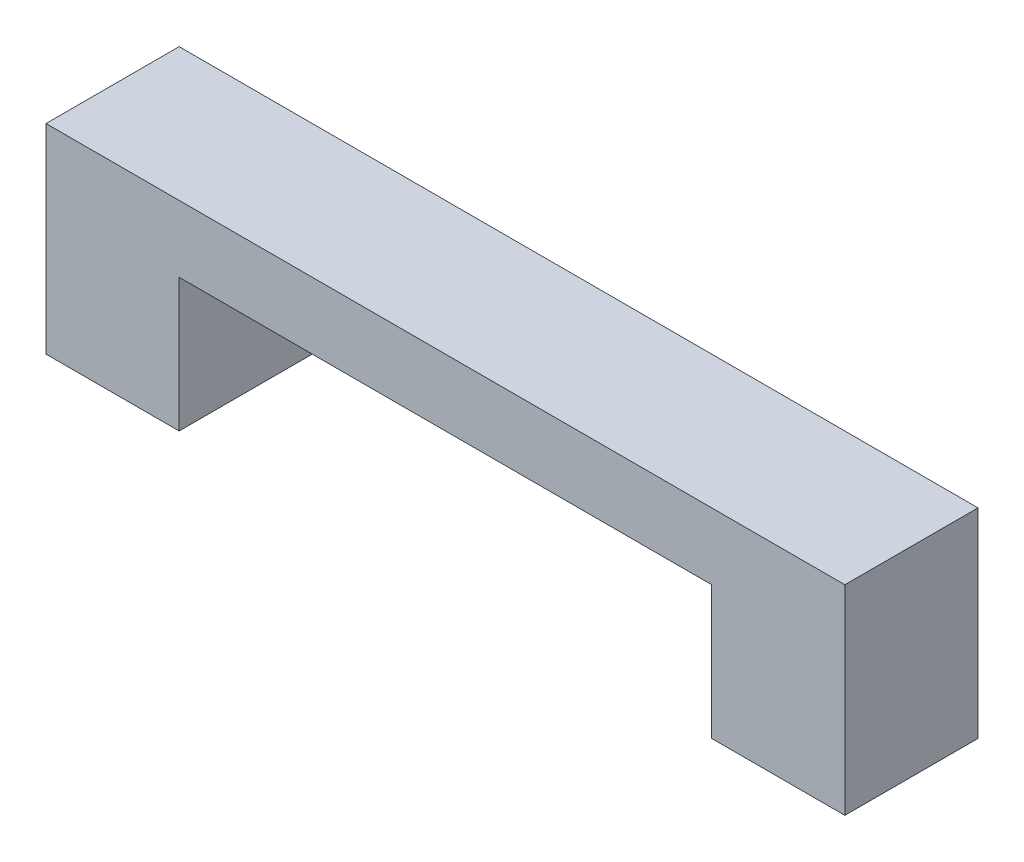
ISO-10303-21;
HEADER;
FILE_DESCRIPTION(('STEP AP214'),'2;1');
FILE_NAME('part.step','',(''),(''),'','','');
FILE_SCHEMA(('AUTOMOTIVE_DESIGN { 1 0 10303 214 1 1 1 1 }'));
ENDSEC;
DATA;
#1=APPLICATION_CONTEXT('core data for automotive mechanical design processes');
#2=APPLICATION_PROTOCOL_DEFINITION('international standard','automotive_design',2000,#1);
#3=PRODUCT_CONTEXT('',#1,'mechanical');
#4=PRODUCT('Part','Part','',(#3));
#5=PRODUCT_RELATED_PRODUCT_CATEGORY('part','',(#4));
#6=PRODUCT_DEFINITION_FORMATION('','',#4);
#7=PRODUCT_DEFINITION_CONTEXT('part definition',#1,'design');
#8=PRODUCT_DEFINITION('design','',#6,#7);
#9=PRODUCT_DEFINITION_SHAPE('','',#8);
#10=(LENGTH_UNIT() NAMED_UNIT(*) SI_UNIT(.MILLI.,.METRE.));
#11=(NAMED_UNIT(*) PLANE_ANGLE_UNIT() SI_UNIT($,.RADIAN.));
#12=(NAMED_UNIT(*) SI_UNIT($,.STERADIAN.) SOLID_ANGLE_UNIT());
#13=UNCERTAINTY_MEASURE_WITH_UNIT(LENGTH_MEASURE(1.E-05),#10,'distance_accuracy_value','');
#14=(GEOMETRIC_REPRESENTATION_CONTEXT(3) GLOBAL_UNCERTAINTY_ASSIGNED_CONTEXT((#13)) GLOBAL_UNIT_ASSIGNED_CONTEXT((#10,
#11,#12)) REPRESENTATION_CONTEXT('',''));
#15=CARTESIAN_POINT('',(0.,0.,0.));
#16=DIRECTION('',(0.,0.,1.));
#17=DIRECTION('',(1.,0.,0.));
#18=AXIS2_PLACEMENT_3D('',#15,#16,#17);
#19=CARTESIAN_POINT('',(0.,0.,2.));
#20=DIRECTION('',(-1.,0.,0.));
#21=DIRECTION('',(0.,0.,1.));
#22=AXIS2_PLACEMENT_3D('',#19,#20,#21);
#23=PLANE('',#22);
#24=DIRECTION('',(0.,1.,0.));
#25=VECTOR('',#24,1.);
#26=CARTESIAN_POINT('',(0.,0.,0.));
#27=LINE('',#26,#25);
#28=CARTESIAN_POINT('',(0.,0.,0.));
#29=VERTEX_POINT('',#28);
#30=CARTESIAN_POINT('',(0.,2.,0.));
#31=VERTEX_POINT('',#30);
#32=EDGE_CURVE('E145',#29,#31,#27,.T.);
#33=ORIENTED_EDGE('',*,*,#32,.T.);
#34=DIRECTION('',(0.,0.,-1.));
#35=VECTOR('',#34,1.);
#36=CARTESIAN_POINT('',(0.,2.,2.));
#37=LINE('',#36,#35);
#38=CARTESIAN_POINT('',(0.,2.,2.));
#39=VERTEX_POINT('',#38);
#40=EDGE_CURVE('E11',#39,#31,#37,.T.);
#41=ORIENTED_EDGE('',*,*,#40,.F.);
#42=DIRECTION('',(0.,1.,0.));
#43=VECTOR('',#42,1.);
#44=CARTESIAN_POINT('',(0.,0.,2.));
#45=LINE('',#44,#43);
#46=CARTESIAN_POINT('',(0.,0.,2.));
#47=VERTEX_POINT('',#46);
#48=EDGE_CURVE('E166',#47,#39,#45,.T.);
#49=ORIENTED_EDGE('',*,*,#48,.F.);
#50=DIRECTION('',(0.,0.,-1.));
#51=VECTOR('',#50,1.);
#52=CARTESIAN_POINT('',(0.,0.,2.));
#53=LINE('',#52,#51);
#54=EDGE_CURVE('E141',#47,#29,#53,.T.);
#55=ORIENTED_EDGE('',*,*,#54,.T.);
#56=EDGE_LOOP('',(#33,#41,#49,#55));
#57=FACE_BOUND('',#56,.T.);
#58=ADVANCED_FACE('F43',(#57),#23,.F.);
#59=CARTESIAN_POINT('',(0.,2.,2.));
#60=DIRECTION('',(0.,1.,0.));
#61=DIRECTION('',(0.,0.,1.));
#62=AXIS2_PLACEMENT_3D('',#59,#60,#61);
#63=PLANE('',#62);
#64=DIRECTION('',(1.,0.,0.));
#65=VECTOR('',#64,1.);
#66=CARTESIAN_POINT('',(0.,2.,0.));
#67=LINE('',#66,#65);
#68=CARTESIAN_POINT('',(8.,2.,0.));
#69=VERTEX_POINT('',#68);
#70=EDGE_CURVE('E149',#31,#69,#67,.T.);
#71=ORIENTED_EDGE('',*,*,#70,.T.);
#72=DIRECTION('',(0.,0.,-1.));
#73=VECTOR('',#72,1.);
#74=CARTESIAN_POINT('',(8.,2.,2.));
#75=LINE('',#74,#73);
#76=CARTESIAN_POINT('',(8.,2.,2.));
#77=VERTEX_POINT('',#76);
#78=EDGE_CURVE('E52',#77,#69,#75,.T.);
#79=ORIENTED_EDGE('',*,*,#78,.F.);
#80=DIRECTION('',(1.,0.,0.));
#81=VECTOR('',#80,1.);
#82=CARTESIAN_POINT('',(0.,2.,2.));
#83=LINE('',#82,#81);
#84=EDGE_CURVE('E103',#39,#77,#83,.T.);
#85=ORIENTED_EDGE('',*,*,#84,.F.);
#86=ORIENTED_EDGE('',*,*,#40,.T.);
#87=EDGE_LOOP('',(#71,#79,#85,#86));
#88=FACE_BOUND('',#87,.T.);
#89=ADVANCED_FACE('F212',(#88),#63,.F.);
#90=CARTESIAN_POINT('',(8.,0.,2.));
#91=DIRECTION('',(1.,0.,0.));
#92=DIRECTION('',(0.,1.,0.));
#93=AXIS2_PLACEMENT_3D('',#90,#91,#92);
#94=PLANE('',#93);
#95=DIRECTION('',(0.,-1.,0.));
#96=VECTOR('',#95,1.);
#97=CARTESIAN_POINT('',(8.,0.,0.));
#98=LINE('',#97,#96);
#99=CARTESIAN_POINT('',(8.,0.,0.));
#100=VERTEX_POINT('',#99);
#101=EDGE_CURVE('E151',#69,#100,#98,.T.);
#102=ORIENTED_EDGE('',*,*,#101,.T.);
#103=DIRECTION('',(0.,0.,-1.));
#104=VECTOR('',#103,1.);
#105=CARTESIAN_POINT('',(8.,0.,2.));
#106=LINE('',#105,#104);
#107=CARTESIAN_POINT('',(8.,0.,2.));
#108=VERTEX_POINT('',#107);
#109=EDGE_CURVE('E177',#108,#100,#106,.T.);
#110=ORIENTED_EDGE('',*,*,#109,.F.);
#111=DIRECTION('',(0.,-1.,0.));
#112=VECTOR('',#111,1.);
#113=CARTESIAN_POINT('',(8.,0.,2.));
#114=LINE('',#113,#112);
#115=EDGE_CURVE('E188',#77,#108,#114,.T.);
#116=ORIENTED_EDGE('',*,*,#115,.F.);
#117=ORIENTED_EDGE('',*,*,#78,.T.);
#118=EDGE_LOOP('',(#102,#110,#116,#117));
#119=FACE_BOUND('',#118,.T.);
#120=ADVANCED_FACE('F186',(#119),#94,.F.);
#121=CARTESIAN_POINT('',(10.,0.,2.));
#122=DIRECTION('',(0.,1.,0.));
#123=DIRECTION('',(0.,0.,1.));
#124=AXIS2_PLACEMENT_3D('',#121,#122,#123);
#125=PLANE('',#124);
#126=DIRECTION('',(1.,0.,0.));
#127=VECTOR('',#126,1.);
#128=CARTESIAN_POINT('',(10.,0.,0.));
#129=LINE('',#128,#127);
#130=CARTESIAN_POINT('',(10.,0.,0.));
#131=VERTEX_POINT('',#130);
#132=EDGE_CURVE('E154',#100,#131,#129,.T.);
#133=ORIENTED_EDGE('',*,*,#132,.T.);
#134=DIRECTION('',(0.,0.,-1.));
#135=VECTOR('',#134,1.);
#136=CARTESIAN_POINT('',(10.,0.,2.));
#137=LINE('',#136,#135);
#138=CARTESIAN_POINT('',(10.,0.,2.));
#139=VERTEX_POINT('',#138);
#140=EDGE_CURVE('E173',#139,#131,#137,.T.);
#141=ORIENTED_EDGE('',*,*,#140,.F.);
#142=DIRECTION('',(1.,0.,0.));
#143=VECTOR('',#142,1.);
#144=CARTESIAN_POINT('',(10.,0.,2.));
#145=LINE('',#144,#143);
#146=EDGE_CURVE('E200',#108,#139,#145,.T.);
#147=ORIENTED_EDGE('',*,*,#146,.F.);
#148=ORIENTED_EDGE('',*,*,#109,.T.);
#149=EDGE_LOOP('',(#133,#141,#147,#148));
#150=FACE_BOUND('',#149,.T.);
#151=ADVANCED_FACE('F196',(#150),#125,.F.);
#152=CARTESIAN_POINT('',(10.,3.,2.));
#153=DIRECTION('',(-1.,0.,0.));
#154=DIRECTION('',(0.,-1.,0.));
#155=AXIS2_PLACEMENT_3D('',#152,#153,#154);
#156=PLANE('',#155);
#157=DIRECTION('',(0.,1.,0.));
#158=VECTOR('',#157,1.);
#159=CARTESIAN_POINT('',(10.,3.,0.));
#160=LINE('',#159,#158);
#161=CARTESIAN_POINT('',(10.,3.,0.));
#162=VERTEX_POINT('',#161);
#163=EDGE_CURVE('E157',#131,#162,#160,.T.);
#164=ORIENTED_EDGE('',*,*,#163,.T.);
#165=DIRECTION('',(0.,0.,-1.));
#166=VECTOR('',#165,1.);
#167=CARTESIAN_POINT('',(10.,3.,2.));
#168=LINE('',#167,#166);
#169=CARTESIAN_POINT('',(10.,3.,2.));
#170=VERTEX_POINT('',#169);
#171=EDGE_CURVE('E133',#170,#162,#168,.T.);
#172=ORIENTED_EDGE('',*,*,#171,.F.);
#173=DIRECTION('',(0.,1.,0.));
#174=VECTOR('',#173,1.);
#175=CARTESIAN_POINT('',(10.,3.,2.));
#176=LINE('',#175,#174);
#177=EDGE_CURVE('E122',#139,#170,#176,.T.);
#178=ORIENTED_EDGE('',*,*,#177,.F.);
#179=ORIENTED_EDGE('',*,*,#140,.T.);
#180=EDGE_LOOP('',(#164,#172,#178,#179));
#181=FACE_BOUND('',#180,.T.);
#182=ADVANCED_FACE('F199',(#181),#156,.F.);
#183=CARTESIAN_POINT('',(-2.,3.,2.));
#184=DIRECTION('',(0.,-1.,0.));
#185=DIRECTION('',(0.,0.,-1.));
#186=AXIS2_PLACEMENT_3D('',#183,#184,#185);
#187=PLANE('',#186);
#188=DIRECTION('',(-1.,0.,0.));
#189=VECTOR('',#188,1.);
#190=CARTESIAN_POINT('',(-2.,3.,0.));
#191=LINE('',#190,#189);
#192=CARTESIAN_POINT('',(-2.,3.,0.));
#193=VERTEX_POINT('',#192);
#194=EDGE_CURVE('E131',#162,#193,#191,.T.);
#195=ORIENTED_EDGE('',*,*,#194,.T.);
#196=DIRECTION('',(0.,0.,-1.));
#197=VECTOR('',#196,1.);
#198=CARTESIAN_POINT('',(-2.,3.,2.));
#199=LINE('',#198,#197);
#200=CARTESIAN_POINT('',(-2.,3.,2.));
#201=VERTEX_POINT('',#200);
#202=EDGE_CURVE('E128',#201,#193,#199,.T.);
#203=ORIENTED_EDGE('',*,*,#202,.F.);
#204=DIRECTION('',(-1.,0.,0.));
#205=VECTOR('',#204,1.);
#206=CARTESIAN_POINT('',(-2.,3.,2.));
#207=LINE('',#206,#205);
#208=EDGE_CURVE('E116',#170,#201,#207,.T.);
#209=ORIENTED_EDGE('',*,*,#208,.F.);
#210=ORIENTED_EDGE('',*,*,#171,.T.);
#211=EDGE_LOOP('',(#195,#203,#209,#210));
#212=FACE_BOUND('',#211,.T.);
#213=ADVANCED_FACE('F129',(#212),#187,.F.);
#214=CARTESIAN_POINT('',(-2.,0.,2.));
#215=DIRECTION('',(1.,0.,0.));
#216=DIRECTION('',(0.,0.,-1.));
#217=AXIS2_PLACEMENT_3D('',#214,#215,#216);
#218=PLANE('',#217);
#219=DIRECTION('',(0.,-1.,0.));
#220=VECTOR('',#219,1.);
#221=CARTESIAN_POINT('',(-2.,0.,0.));
#222=LINE('',#221,#220);
#223=CARTESIAN_POINT('',(-2.,0.,0.));
#224=VERTEX_POINT('',#223);
#225=EDGE_CURVE('E89',#193,#224,#222,.T.);
#226=ORIENTED_EDGE('',*,*,#225,.T.);
#227=DIRECTION('',(0.,0.,-1.));
#228=VECTOR('',#227,1.);
#229=CARTESIAN_POINT('',(-2.,0.,2.));
#230=LINE('',#229,#228);
#231=CARTESIAN_POINT('',(-2.,0.,2.));
#232=VERTEX_POINT('',#231);
#233=EDGE_CURVE('E134',#232,#224,#230,.T.);
#234=ORIENTED_EDGE('',*,*,#233,.F.);
#235=DIRECTION('',(0.,-1.,0.));
#236=VECTOR('',#235,1.);
#237=CARTESIAN_POINT('',(-2.,0.,2.));
#238=LINE('',#237,#236);
#239=EDGE_CURVE('E120',#201,#232,#238,.T.);
#240=ORIENTED_EDGE('',*,*,#239,.F.);
#241=ORIENTED_EDGE('',*,*,#202,.T.);
#242=EDGE_LOOP('',(#226,#234,#240,#241));
#243=FACE_BOUND('',#242,.T.);
#244=ADVANCED_FACE('F136',(#243),#218,.F.);
#245=CARTESIAN_POINT('',(0.,0.,2.));
#246=DIRECTION('',(0.,1.,0.));
#247=DIRECTION('',(0.,0.,1.));
#248=AXIS2_PLACEMENT_3D('',#245,#246,#247);
#249=PLANE('',#248);
#250=DIRECTION('',(1.,0.,0.));
#251=VECTOR('',#250,1.);
#252=CARTESIAN_POINT('',(0.,0.,0.));
#253=LINE('',#252,#251);
#254=EDGE_CURVE('E95',#224,#29,#253,.T.);
#255=ORIENTED_EDGE('',*,*,#254,.T.);
#256=ORIENTED_EDGE('',*,*,#54,.F.);
#257=DIRECTION('',(1.,0.,0.));
#258=VECTOR('',#257,1.);
#259=CARTESIAN_POINT('',(0.,0.,2.));
#260=LINE('',#259,#258);
#261=EDGE_CURVE('E60',#232,#47,#260,.T.);
#262=ORIENTED_EDGE('',*,*,#261,.F.);
#263=ORIENTED_EDGE('',*,*,#233,.T.);
#264=EDGE_LOOP('',(#255,#256,#262,#263));
#265=FACE_BOUND('',#264,.T.);
#266=ADVANCED_FACE('F227',(#265),#249,.F.);
#267=CARTESIAN_POINT('',(0.,0.,2.));
#268=DIRECTION('',(0.,0.,-1.));
#269=DIRECTION('',(-1.,0.,0.));
#270=AXIS2_PLACEMENT_3D('',#267,#268,#269);
#271=PLANE('',#270);
#272=ORIENTED_EDGE('',*,*,#48,.T.);
#273=ORIENTED_EDGE('',*,*,#84,.T.);
#274=ORIENTED_EDGE('',*,*,#115,.T.);
#275=ORIENTED_EDGE('',*,*,#146,.T.);
#276=ORIENTED_EDGE('',*,*,#177,.T.);
#277=ORIENTED_EDGE('',*,*,#208,.T.);
#278=ORIENTED_EDGE('',*,*,#239,.T.);
#279=ORIENTED_EDGE('',*,*,#261,.T.);
#280=EDGE_LOOP('',(#272,#273,#274,#275,#276,#277,#278,#279));
#281=FACE_BOUND('',#280,.T.);
#282=ADVANCED_FACE('F118',(#281),#271,.F.);
#283=CARTESIAN_POINT('',(0.,0.,0.));
#284=DIRECTION('',(0.,0.,-1.));
#285=DIRECTION('',(-1.,0.,0.));
#286=AXIS2_PLACEMENT_3D('',#283,#284,#285);
#287=PLANE('',#286);
#288=ORIENTED_EDGE('',*,*,#32,.F.);
#289=ORIENTED_EDGE('',*,*,#254,.F.);
#290=ORIENTED_EDGE('',*,*,#225,.F.);
#291=ORIENTED_EDGE('',*,*,#194,.F.);
#292=ORIENTED_EDGE('',*,*,#163,.F.);
#293=ORIENTED_EDGE('',*,*,#132,.F.);
#294=ORIENTED_EDGE('',*,*,#101,.F.);
#295=ORIENTED_EDGE('',*,*,#70,.F.);
#296=EDGE_LOOP('',(#288,#289,#290,#291,#292,#293,#294,#295));
#297=FACE_BOUND('',#296,.T.);
#298=ADVANCED_FACE('F192',(#297),#287,.T.);
#299=CLOSED_SHELL('',(#58,#89,#120,#151,#182,#213,#244,#266,#282,#298));
#300=MANIFOLD_SOLID_BREP('B2',#299);
#301=ADVANCED_BREP_SHAPE_REPRESENTATION('',(#18,#300),#14);
#302=SHAPE_DEFINITION_REPRESENTATION(#9,#301);
ENDSEC;
END-ISO-10303-21;
